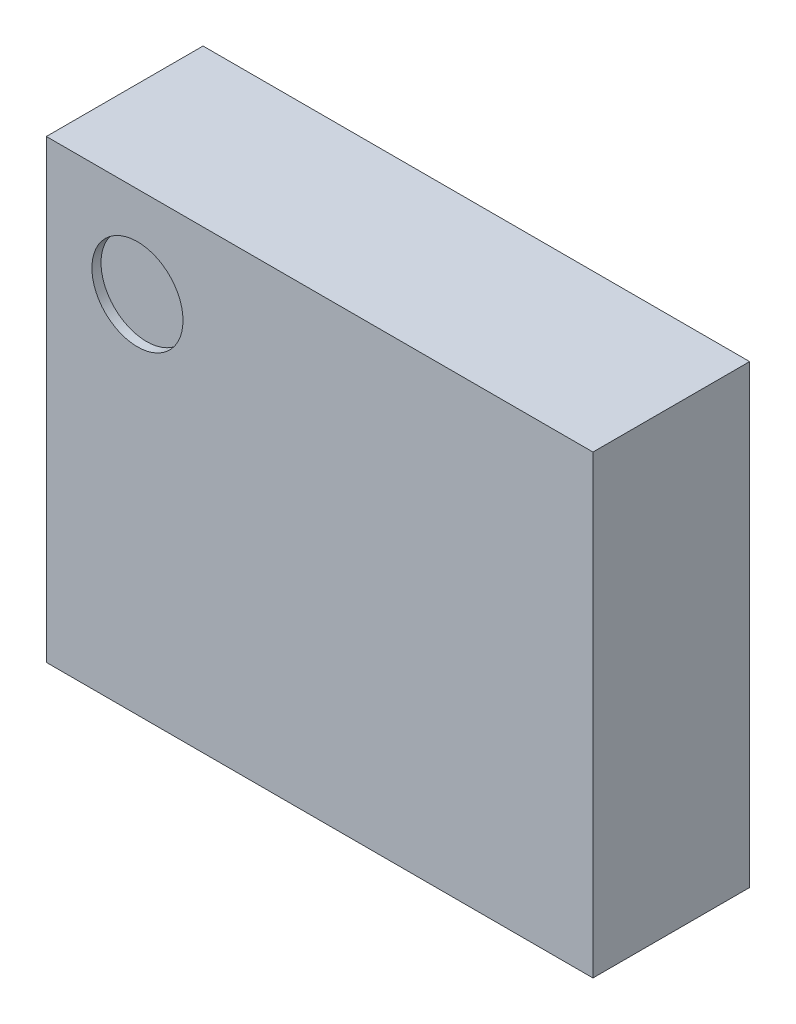
ISO-10303-21;
HEADER;
FILE_DESCRIPTION(('STEP AP214'),'2;1');
FILE_NAME('part.step','',(''),(''),'','','');
FILE_SCHEMA(('AUTOMOTIVE_DESIGN { 1 0 10303 214 1 1 1 1 }'));
ENDSEC;
DATA;
#1=APPLICATION_CONTEXT('core data for automotive mechanical design processes');
#2=APPLICATION_PROTOCOL_DEFINITION('international standard','automotive_design',2000,#1);
#3=PRODUCT_CONTEXT('',#1,'mechanical');
#4=PRODUCT('Part','Part','',(#3));
#5=PRODUCT_RELATED_PRODUCT_CATEGORY('part','',(#4));
#6=PRODUCT_DEFINITION_FORMATION('','',#4);
#7=PRODUCT_DEFINITION_CONTEXT('part definition',#1,'design');
#8=PRODUCT_DEFINITION('design','',#6,#7);
#9=PRODUCT_DEFINITION_SHAPE('','',#8);
#10=(LENGTH_UNIT() NAMED_UNIT(*) SI_UNIT(.MILLI.,.METRE.));
#11=(NAMED_UNIT(*) PLANE_ANGLE_UNIT() SI_UNIT($,.RADIAN.));
#12=(NAMED_UNIT(*) SI_UNIT($,.STERADIAN.) SOLID_ANGLE_UNIT());
#13=UNCERTAINTY_MEASURE_WITH_UNIT(LENGTH_MEASURE(1.E-05),#10,'distance_accuracy_value','');
#14=(GEOMETRIC_REPRESENTATION_CONTEXT(3) GLOBAL_UNCERTAINTY_ASSIGNED_CONTEXT((#13)) GLOBAL_UNIT_ASSIGNED_CONTEXT((#10,
#11,#12)) REPRESENTATION_CONTEXT('',''));
#15=CARTESIAN_POINT('',(0.,0.,0.));
#16=DIRECTION('',(0.,0.,1.));
#17=DIRECTION('',(1.,0.,0.));
#18=AXIS2_PLACEMENT_3D('',#15,#16,#17);
#19=CARTESIAN_POINT('',(1.5,1.25,0.86));
#20=DIRECTION('',(-1.,0.,0.));
#21=DIRECTION('',(0.,-1.,0.));
#22=AXIS2_PLACEMENT_3D('',#19,#20,#21);
#23=PLANE('',#22);
#24=DIRECTION('',(0.,1.,0.));
#25=VECTOR('',#24,1.);
#26=CARTESIAN_POINT('',(1.5,1.25,0.));
#27=LINE('',#26,#25);
#28=CARTESIAN_POINT('',(1.5,-1.25,0.));
#29=VERTEX_POINT('',#28);
#30=CARTESIAN_POINT('',(1.5,1.25,0.));
#31=VERTEX_POINT('',#30);
#32=EDGE_CURVE('E98',#29,#31,#27,.T.);
#33=ORIENTED_EDGE('',*,*,#32,.T.);
#34=DIRECTION('',(0.,0.,-1.));
#35=VECTOR('',#34,1.);
#36=CARTESIAN_POINT('',(1.5,1.25,0.86));
#37=LINE('',#36,#35);
#38=CARTESIAN_POINT('',(1.5,1.25,0.86));
#39=VERTEX_POINT('',#38);
#40=EDGE_CURVE('E11',#39,#31,#37,.T.);
#41=ORIENTED_EDGE('',*,*,#40,.F.);
#42=DIRECTION('',(0.,1.,0.));
#43=VECTOR('',#42,1.);
#44=CARTESIAN_POINT('',(1.5,1.25,0.86));
#45=LINE('',#44,#43);
#46=CARTESIAN_POINT('',(1.5,-1.25,0.86));
#47=VERTEX_POINT('',#46);
#48=EDGE_CURVE('E86',#47,#39,#45,.T.);
#49=ORIENTED_EDGE('',*,*,#48,.F.);
#50=DIRECTION('',(0.,0.,-1.));
#51=VECTOR('',#50,1.);
#52=CARTESIAN_POINT('',(1.5,-1.25,0.86));
#53=LINE('',#52,#51);
#54=EDGE_CURVE('E94',#47,#29,#53,.T.);
#55=ORIENTED_EDGE('',*,*,#54,.T.);
#56=EDGE_LOOP('',(#33,#41,#49,#55));
#57=FACE_BOUND('',#56,.T.);
#58=ADVANCED_FACE('F35',(#57),#23,.F.);
#59=CARTESIAN_POINT('',(-1.5,1.25,0.86));
#60=DIRECTION('',(0.,-1.,0.));
#61=DIRECTION('',(0.,0.,-1.));
#62=AXIS2_PLACEMENT_3D('',#59,#60,#61);
#63=PLANE('',#62);
#64=DIRECTION('',(-1.,0.,0.));
#65=VECTOR('',#64,1.);
#66=CARTESIAN_POINT('',(-1.5,1.25,0.));
#67=LINE('',#66,#65);
#68=CARTESIAN_POINT('',(-1.5,1.25,0.));
#69=VERTEX_POINT('',#68);
#70=EDGE_CURVE('E90',#31,#69,#67,.T.);
#71=ORIENTED_EDGE('',*,*,#70,.T.);
#72=DIRECTION('',(0.,0.,-1.));
#73=VECTOR('',#72,1.);
#74=CARTESIAN_POINT('',(-1.5,1.25,0.86));
#75=LINE('',#74,#73);
#76=CARTESIAN_POINT('',(-1.5,1.25,0.86));
#77=VERTEX_POINT('',#76);
#78=EDGE_CURVE('E43',#77,#69,#75,.T.);
#79=ORIENTED_EDGE('',*,*,#78,.F.);
#80=DIRECTION('',(-1.,0.,0.));
#81=VECTOR('',#80,1.);
#82=CARTESIAN_POINT('',(-1.5,1.25,0.86));
#83=LINE('',#82,#81);
#84=EDGE_CURVE('E81',#39,#77,#83,.T.);
#85=ORIENTED_EDGE('',*,*,#84,.F.);
#86=ORIENTED_EDGE('',*,*,#40,.T.);
#87=EDGE_LOOP('',(#71,#79,#85,#86));
#88=FACE_BOUND('',#87,.T.);
#89=ADVANCED_FACE('F89',(#88),#63,.F.);
#90=CARTESIAN_POINT('',(-1.5,1.25,0.86));
#91=DIRECTION('',(1.,0.,0.));
#92=DIRECTION('',(0.,1.,0.));
#93=AXIS2_PLACEMENT_3D('',#90,#91,#92);
#94=PLANE('',#93);
#95=DIRECTION('',(0.,-1.,0.));
#96=VECTOR('',#95,1.);
#97=CARTESIAN_POINT('',(-1.5,1.25,0.));
#98=LINE('',#97,#96);
#99=CARTESIAN_POINT('',(-1.5,-1.25,0.));
#100=VERTEX_POINT('',#99);
#101=EDGE_CURVE('E68',#69,#100,#98,.T.);
#102=ORIENTED_EDGE('',*,*,#101,.T.);
#103=DIRECTION('',(0.,0.,-1.));
#104=VECTOR('',#103,1.);
#105=CARTESIAN_POINT('',(-1.5,-1.25,0.86));
#106=LINE('',#105,#104);
#107=CARTESIAN_POINT('',(-1.5,-1.25,0.86));
#108=VERTEX_POINT('',#107);
#109=EDGE_CURVE('E91',#108,#100,#106,.T.);
#110=ORIENTED_EDGE('',*,*,#109,.F.);
#111=DIRECTION('',(0.,-1.,0.));
#112=VECTOR('',#111,1.);
#113=CARTESIAN_POINT('',(-1.5,1.25,0.86));
#114=LINE('',#113,#112);
#115=EDGE_CURVE('E84',#77,#108,#114,.T.);
#116=ORIENTED_EDGE('',*,*,#115,.F.);
#117=ORIENTED_EDGE('',*,*,#78,.T.);
#118=EDGE_LOOP('',(#102,#110,#116,#117));
#119=FACE_BOUND('',#118,.T.);
#120=ADVANCED_FACE('F92',(#119),#94,.F.);
#121=CARTESIAN_POINT('',(-1.5,-1.25,0.86));
#122=DIRECTION('',(0.,1.,0.));
#123=DIRECTION('',(0.,0.,1.));
#124=AXIS2_PLACEMENT_3D('',#121,#122,#123);
#125=PLANE('',#124);
#126=DIRECTION('',(1.,0.,0.));
#127=VECTOR('',#126,1.);
#128=CARTESIAN_POINT('',(-1.5,-1.25,0.));
#129=LINE('',#128,#127);
#130=EDGE_CURVE('E74',#100,#29,#129,.T.);
#131=ORIENTED_EDGE('',*,*,#130,.T.);
#132=ORIENTED_EDGE('',*,*,#54,.F.);
#133=DIRECTION('',(1.,0.,0.));
#134=VECTOR('',#133,1.);
#135=CARTESIAN_POINT('',(-1.5,-1.25,0.86));
#136=LINE('',#135,#134);
#137=EDGE_CURVE('E51',#108,#47,#136,.T.);
#138=ORIENTED_EDGE('',*,*,#137,.F.);
#139=ORIENTED_EDGE('',*,*,#109,.T.);
#140=EDGE_LOOP('',(#131,#132,#138,#139));
#141=FACE_BOUND('',#140,.T.);
#142=ADVANCED_FACE('F106',(#141),#125,.F.);
#143=CARTESIAN_POINT('',(0.,0.,0.86));
#144=DIRECTION('',(0.,0.,1.));
#145=DIRECTION('',(1.,0.,0.));
#146=AXIS2_PLACEMENT_3D('',#143,#144,#145);
#147=PLANE('',#146);
#148=CARTESIAN_POINT('',(-1.,0.75,0.86));
#149=DIRECTION('',(0.,0.,1.));
#150=DIRECTION('',(1.,0.,0.));
#151=AXIS2_PLACEMENT_3D('',#148,#149,#150);
#152=CIRCLE('',#151,0.25);
#153=CARTESIAN_POINT('',(-0.75,0.75,0.86));
#154=VERTEX_POINT('',#153);
#155=EDGE_CURVE('E112',#154,#154,#152,.T.);
#156=ORIENTED_EDGE('',*,*,#155,.F.);
#157=EDGE_LOOP('',(#156));
#158=FACE_BOUND('',#157,.T.);
#159=ORIENTED_EDGE('',*,*,#48,.T.);
#160=ORIENTED_EDGE('',*,*,#84,.T.);
#161=ORIENTED_EDGE('',*,*,#115,.T.);
#162=ORIENTED_EDGE('',*,*,#137,.T.);
#163=EDGE_LOOP('',(#159,#160,#161,#162));
#164=FACE_BOUND('',#163,.T.);
#165=ADVANCED_FACE('F82',(#158,#164),#147,.T.);
#166=CARTESIAN_POINT('',(0.,0.,0.));
#167=DIRECTION('',(0.,0.,1.));
#168=DIRECTION('',(1.,0.,0.));
#169=AXIS2_PLACEMENT_3D('',#166,#167,#168);
#170=PLANE('',#169);
#171=ORIENTED_EDGE('',*,*,#32,.F.);
#172=ORIENTED_EDGE('',*,*,#130,.F.);
#173=ORIENTED_EDGE('',*,*,#101,.F.);
#174=ORIENTED_EDGE('',*,*,#70,.F.);
#175=EDGE_LOOP('',(#171,#172,#173,#174));
#176=FACE_BOUND('',#175,.T.);
#177=ADVANCED_FACE('F109',(#176),#170,.F.);
#178=CARTESIAN_POINT('',(-1.,0.75,0.81));
#179=DIRECTION('',(0.,0.,1.));
#180=DIRECTION('',(1.,0.,0.));
#181=AXIS2_PLACEMENT_3D('',#178,#179,#180);
#182=CYLINDRICAL_SURFACE('',#181,0.25);
#183=CARTESIAN_POINT('',(-1.,0.75,0.81));
#184=DIRECTION('',(0.,0.,1.));
#185=DIRECTION('',(1.,0.,0.));
#186=AXIS2_PLACEMENT_3D('',#183,#184,#185);
#187=CIRCLE('',#186,0.25);
#188=CARTESIAN_POINT('',(-0.75,0.75,0.81));
#189=VERTEX_POINT('',#188);
#190=EDGE_CURVE('E101',#189,#189,#187,.T.);
#191=ORIENTED_EDGE('',*,*,#190,.F.);
#192=EDGE_LOOP('',(#191));
#193=FACE_BOUND('',#192,.T.);
#194=ORIENTED_EDGE('',*,*,#155,.T.);
#195=EDGE_LOOP('',(#194));
#196=FACE_BOUND('',#195,.T.);
#197=ADVANCED_FACE('F120',(#193,#196),#182,.F.);
#198=CARTESIAN_POINT('',(-1.,0.75,0.81));
#199=DIRECTION('',(0.,0.,1.));
#200=DIRECTION('',(1.,0.,0.));
#201=AXIS2_PLACEMENT_3D('',#198,#199,#200);
#202=PLANE('',#201);
#203=ORIENTED_EDGE('',*,*,#190,.T.);
#204=EDGE_LOOP('',(#203));
#205=FACE_BOUND('',#204,.T.);
#206=ADVANCED_FACE('F118',(#205),#202,.T.);
#207=CLOSED_SHELL('',(#58,#89,#120,#142,#165,#177,#197,#206));
#208=MANIFOLD_SOLID_BREP('B2',#207);
#209=ADVANCED_BREP_SHAPE_REPRESENTATION('',(#18,#208),#14);
#210=SHAPE_DEFINITION_REPRESENTATION(#9,#209);
ENDSEC;
END-ISO-10303-21;
